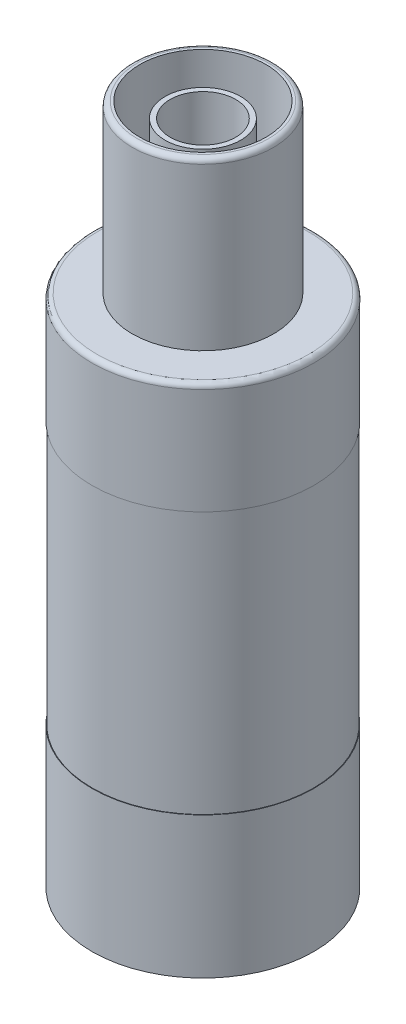
ISO-10303-21;
HEADER;
FILE_DESCRIPTION(('STEP AP214'),'2;1');
FILE_NAME('part.step','',(''),(''),'','','');
FILE_SCHEMA(('AUTOMOTIVE_DESIGN { 1 0 10303 214 1 1 1 1 }'));
ENDSEC;
DATA;
#1=APPLICATION_CONTEXT('core data for automotive mechanical design processes');
#2=APPLICATION_PROTOCOL_DEFINITION('international standard','automotive_design',2000,#1);
#3=PRODUCT_CONTEXT('',#1,'mechanical');
#4=PRODUCT('Part','Part','',(#3));
#5=PRODUCT_RELATED_PRODUCT_CATEGORY('part','',(#4));
#6=PRODUCT_DEFINITION_FORMATION('','',#4);
#7=PRODUCT_DEFINITION_CONTEXT('part definition',#1,'design');
#8=PRODUCT_DEFINITION('design','',#6,#7);
#9=PRODUCT_DEFINITION_SHAPE('','',#8);
#10=(LENGTH_UNIT() NAMED_UNIT(*) SI_UNIT(.MILLI.,.METRE.));
#11=(NAMED_UNIT(*) PLANE_ANGLE_UNIT() SI_UNIT($,.RADIAN.));
#12=(NAMED_UNIT(*) SI_UNIT($,.STERADIAN.) SOLID_ANGLE_UNIT());
#13=UNCERTAINTY_MEASURE_WITH_UNIT(LENGTH_MEASURE(1.E-05),#10,'distance_accuracy_value','');
#14=(GEOMETRIC_REPRESENTATION_CONTEXT(3) GLOBAL_UNCERTAINTY_ASSIGNED_CONTEXT((#13)) GLOBAL_UNIT_ASSIGNED_CONTEXT((#10,
#11,#12)) REPRESENTATION_CONTEXT('',''));
#15=CARTESIAN_POINT('',(0.,0.,0.));
#16=DIRECTION('',(0.,0.,1.));
#17=DIRECTION('',(1.,0.,0.));
#18=AXIS2_PLACEMENT_3D('',#15,#16,#17);
#19=CARTESIAN_POINT('',(0.,14.,0.));
#20=DIRECTION('',(0.,-1.,0.));
#21=DIRECTION('',(0.,0.,-1.));
#22=AXIS2_PLACEMENT_3D('',#19,#20,#21);
#23=CYLINDRICAL_SURFACE('',#22,11.);
#24=CARTESIAN_POINT('',(0.,14.,0.));
#25=DIRECTION('',(0.,1.,0.));
#26=DIRECTION('',(0.,0.,1.));
#27=AXIS2_PLACEMENT_3D('',#24,#25,#26);
#28=CIRCLE('',#27,11.);
#29=CARTESIAN_POINT('',(0.,14.,11.));
#30=VERTEX_POINT('',#29);
#31=EDGE_CURVE('E88',#30,#30,#28,.T.);
#32=ORIENTED_EDGE('',*,*,#31,.F.);
#33=EDGE_LOOP('',(#32));
#34=FACE_BOUND('',#33,.T.);
#35=CARTESIAN_POINT('',(0.,0.,0.));
#36=DIRECTION('',(0.,1.,0.));
#37=DIRECTION('',(0.,0.,1.));
#38=AXIS2_PLACEMENT_3D('',#35,#36,#37);
#39=CIRCLE('',#38,11.);
#40=CARTESIAN_POINT('',(0.,0.,11.));
#41=VERTEX_POINT('',#40);
#42=EDGE_CURVE('E89',#41,#41,#39,.T.);
#43=ORIENTED_EDGE('',*,*,#42,.T.);
#44=EDGE_LOOP('',(#43));
#45=FACE_BOUND('',#44,.T.);
#46=ADVANCED_FACE('F49',(#34,#45),#23,.T.);
#47=CARTESIAN_POINT('',(0.,14.,0.));
#48=DIRECTION('',(0.,1.,0.));
#49=DIRECTION('',(0.,0.,1.));
#50=AXIS2_PLACEMENT_3D('',#47,#48,#49);
#51=PLANE('',#50);
#52=CARTESIAN_POINT('',(0.,14.,0.));
#53=DIRECTION('',(0.,1.,0.));
#54=DIRECTION('',(0.,0.,1.));
#55=AXIS2_PLACEMENT_3D('',#52,#53,#54);
#56=CIRCLE('',#55,10.95);
#57=CARTESIAN_POINT('',(0.,14.,-10.95));
#58=VERTEX_POINT('',#57);
#59=EDGE_CURVE('E95',#58,#58,#56,.T.);
#60=ORIENTED_EDGE('',*,*,#59,.F.);
#61=EDGE_LOOP('',(#60));
#62=FACE_BOUND('',#61,.T.);
#63=ORIENTED_EDGE('',*,*,#31,.T.);
#64=EDGE_LOOP('',(#63));
#65=FACE_BOUND('',#64,.T.);
#66=ADVANCED_FACE('F143',(#62,#65),#51,.T.);
#67=CARTESIAN_POINT('',(0.,0.,0.));
#68=DIRECTION('',(0.,1.,0.));
#69=DIRECTION('',(0.,0.,1.));
#70=AXIS2_PLACEMENT_3D('',#67,#68,#69);
#71=PLANE('',#70);
#72=ORIENTED_EDGE('',*,*,#42,.F.);
#73=EDGE_LOOP('',(#72));
#74=FACE_BOUND('',#73,.T.);
#75=ADVANCED_FACE('F160',(#74),#71,.F.);
#76=CARTESIAN_POINT('',(0.,40.,0.));
#77=DIRECTION('',(0.,-1.,0.));
#78=DIRECTION('',(0.,0.,-1.));
#79=AXIS2_PLACEMENT_3D('',#76,#77,#78);
#80=CYLINDRICAL_SURFACE('',#79,10.95);
#81=CARTESIAN_POINT('',(0.,40.,0.));
#82=DIRECTION('',(0.,1.,0.));
#83=DIRECTION('',(0.,0.,1.));
#84=AXIS2_PLACEMENT_3D('',#81,#82,#83);
#85=CIRCLE('',#84,10.95);
#86=CARTESIAN_POINT('',(0.,40.,-10.95));
#87=VERTEX_POINT('',#86);
#88=EDGE_CURVE('E92',#87,#87,#85,.T.);
#89=CARTESIAN_POINT('',(0.,40.,-10.95));
#90=CARTESIAN_POINT('',(0.,39.7291666666667,-10.95));
#91=CARTESIAN_POINT('',(0.,39.4583333333333,-10.95));
#92=CARTESIAN_POINT('',(0.,38.9166666666667,-10.95));
#93=CARTESIAN_POINT('',(0.,38.6458333333333,-10.95));
#94=CARTESIAN_POINT('',(0.,38.1041666666667,-10.95));
#95=CARTESIAN_POINT('',(0.,37.8333333333333,-10.95));
#96=CARTESIAN_POINT('',(0.,37.2916666666667,-10.95));
#97=CARTESIAN_POINT('',(0.,37.0208333333333,-10.95));
#98=CARTESIAN_POINT('',(0.,36.4791666666667,-10.95));
#99=CARTESIAN_POINT('',(0.,36.2083333333333,-10.95));
#100=CARTESIAN_POINT('',(0.,35.6666666666667,-10.95));
#101=CARTESIAN_POINT('',(0.,35.3958333333333,-10.95));
#102=CARTESIAN_POINT('',(0.,34.8541666666667,-10.95));
#103=CARTESIAN_POINT('',(0.,34.5833333333333,-10.95));
#104=CARTESIAN_POINT('',(0.,34.0416666666667,-10.95));
#105=CARTESIAN_POINT('',(0.,33.7708333333333,-10.95));
#106=CARTESIAN_POINT('',(0.,33.2291666666667,-10.95));
#107=CARTESIAN_POINT('',(0.,32.9583333333333,-10.95));
#108=CARTESIAN_POINT('',(0.,32.4166666666667,-10.95));
#109=CARTESIAN_POINT('',(0.,32.1458333333333,-10.95));
#110=CARTESIAN_POINT('',(0.,31.6041666666667,-10.95));
#111=CARTESIAN_POINT('',(0.,31.3333333333333,-10.95));
#112=CARTESIAN_POINT('',(0.,30.7916666666667,-10.95));
#113=CARTESIAN_POINT('',(0.,30.5208333333333,-10.95));
#114=CARTESIAN_POINT('',(0.,29.9791666666667,-10.95));
#115=CARTESIAN_POINT('',(0.,29.7083333333333,-10.95));
#116=CARTESIAN_POINT('',(0.,29.1666666666667,-10.95));
#117=CARTESIAN_POINT('',(0.,28.8958333333333,-10.95));
#118=CARTESIAN_POINT('',(0.,28.3541666666667,-10.95));
#119=CARTESIAN_POINT('',(0.,28.0833333333333,-10.95));
#120=CARTESIAN_POINT('',(0.,27.5416666666667,-10.95));
#121=CARTESIAN_POINT('',(0.,27.2708333333333,-10.95));
#122=CARTESIAN_POINT('',(0.,26.7291666666667,-10.95));
#123=CARTESIAN_POINT('',(0.,26.4583333333333,-10.95));
#124=CARTESIAN_POINT('',(0.,25.9166666666667,-10.95));
#125=CARTESIAN_POINT('',(0.,25.6458333333333,-10.95));
#126=CARTESIAN_POINT('',(0.,25.1041666666667,-10.95));
#127=CARTESIAN_POINT('',(0.,24.8333333333333,-10.95));
#128=CARTESIAN_POINT('',(0.,24.2916666666667,-10.95));
#129=CARTESIAN_POINT('',(0.,24.0208333333333,-10.95));
#130=CARTESIAN_POINT('',(0.,23.4791666666667,-10.95));
#131=CARTESIAN_POINT('',(0.,23.2083333333333,-10.95));
#132=CARTESIAN_POINT('',(0.,22.6666666666667,-10.95));
#133=CARTESIAN_POINT('',(0.,22.3958333333333,-10.95));
#134=CARTESIAN_POINT('',(0.,21.8541666666667,-10.95));
#135=CARTESIAN_POINT('',(0.,21.5833333333333,-10.95));
#136=CARTESIAN_POINT('',(0.,21.0416666666667,-10.95));
#137=CARTESIAN_POINT('',(0.,20.7708333333333,-10.95));
#138=CARTESIAN_POINT('',(0.,20.2291666666667,-10.95));
#139=CARTESIAN_POINT('',(0.,19.9583333333333,-10.95));
#140=CARTESIAN_POINT('',(0.,19.4166666666667,-10.95));
#141=CARTESIAN_POINT('',(0.,19.1458333333333,-10.95));
#142=CARTESIAN_POINT('',(0.,18.6041666666667,-10.95));
#143=CARTESIAN_POINT('',(0.,18.3333333333333,-10.95));
#144=CARTESIAN_POINT('',(0.,17.7916666666667,-10.95));
#145=CARTESIAN_POINT('',(0.,17.5208333333333,-10.95));
#146=CARTESIAN_POINT('',(0.,16.9791666666667,-10.95));
#147=CARTESIAN_POINT('',(0.,16.7083333333333,-10.95));
#148=CARTESIAN_POINT('',(0.,16.1666666666667,-10.95));
#149=CARTESIAN_POINT('',(0.,15.8958333333333,-10.95));
#150=CARTESIAN_POINT('',(0.,15.3541666666667,-10.95));
#151=CARTESIAN_POINT('',(0.,15.0833333333333,-10.95));
#152=CARTESIAN_POINT('',(0.,14.5416666666667,-10.95));
#153=CARTESIAN_POINT('',(0.,14.2708333333333,-10.95));
#154=CARTESIAN_POINT('',(0.,14.,-10.95));
#155=B_SPLINE_CURVE_WITH_KNOTS('',3,(#89,#90,#91,#92,#93,#94,#95,#96,#97,#98,#99,#100,#101,#102,
#103,#104,#105,#106,#107,#108,#109,#110,#111,#112,#113,#114,#115,#116,#117,#118,#119,#120,#121,
#122,#123,#124,#125,#126,#127,#128,#129,#130,#131,#132,#133,#134,#135,#136,#137,#138,#139,#140,
#141,#142,#143,#144,#145,#146,#147,#148,#149,#150,#151,#152,#153,#154),.UNSPECIFIED.,.F.,.F.,(4,
2,2,2,2,2,2,2,2,2,2,2,2,2,2,2,2,2,2,2,2,2,2,2,2,2,2,2,2,2,2,2,4),(0.,0.812499999999994,
1.62499999999999,2.4375,3.25,4.0625,4.875,5.6875,6.49999999999999,7.31249999999999,
8.12499999999999,8.93749999999999,9.74999999999999,10.5625,11.375,12.1875,13.,13.8125,14.625,
15.4375,16.25,17.0625,17.875,18.6875,19.5,20.3125,21.125,21.9375,22.75,23.5625,24.375,25.1875,
26.),.UNSPECIFIED.);
#156=EDGE_CURVE('BSEAM156',#87,#58,#155,.T.);
#157=ORIENTED_EDGE('',*,*,#88,.F.);
#158=ORIENTED_EDGE('',*,*,#59,.T.);
#159=ORIENTED_EDGE('',*,*,#156,.T.);
#160=ORIENTED_EDGE('',*,*,#156,.F.);
#161=EDGE_LOOP('',(#157,#159,#158,#160));
#162=FACE_BOUND('',#161,.T.);
#163=ADVANCED_FACE('F156',(#162),#80,.T.);
#164=CARTESIAN_POINT('',(0.,40.,0.));
#165=DIRECTION('',(0.,1.,0.));
#166=DIRECTION('',(0.,0.,1.));
#167=AXIS2_PLACEMENT_3D('',#164,#165,#166);
#168=PLANE('',#167);
#169=ORIENTED_EDGE('',*,*,#88,.T.);
#170=EDGE_LOOP('',(#169));
#171=FACE_BOUND('',#170,.T.);
#172=CARTESIAN_POINT('',(0.,40.,0.));
#173=DIRECTION('',(0.,1.,0.));
#174=DIRECTION('',(0.,0.,1.));
#175=AXIS2_PLACEMENT_3D('',#172,#173,#174);
#176=CIRCLE('',#175,11.);
#177=CARTESIAN_POINT('',(0.,40.,11.));
#178=VERTEX_POINT('',#177);
#179=EDGE_CURVE('E103',#178,#178,#176,.T.);
#180=ORIENTED_EDGE('',*,*,#179,.F.);
#181=EDGE_LOOP('',(#180));
#182=FACE_BOUND('',#181,.T.);
#183=ADVANCED_FACE('F154',(#171,#182),#168,.F.);
#184=CARTESIAN_POINT('',(0.,51.,0.));
#185=DIRECTION('',(0.,1.,0.));
#186=DIRECTION('',(0.,0.,1.));
#187=AXIS2_PLACEMENT_3D('',#184,#185,#186);
#188=PLANE('',#187);
#189=CARTESIAN_POINT('',(0.,51.,0.));
#190=DIRECTION('',(0.,1.,0.));
#191=DIRECTION('',(0.,0.,1.));
#192=AXIS2_PLACEMENT_3D('',#189,#190,#191);
#193=CIRCLE('',#192,10.5);
#194=CARTESIAN_POINT('',(0.,51.,10.5));
#195=VERTEX_POINT('',#194);
#196=EDGE_CURVE('E76',#195,#195,#193,.T.);
#197=ORIENTED_EDGE('',*,*,#196,.T.);
#198=EDGE_LOOP('',(#197));
#199=FACE_BOUND('',#198,.T.);
#200=CARTESIAN_POINT('',(0.,51.,0.));
#201=DIRECTION('',(0.,1.,0.));
#202=DIRECTION('',(0.,0.,1.));
#203=AXIS2_PLACEMENT_3D('',#200,#201,#202);
#204=CIRCLE('',#203,7.);
#205=CARTESIAN_POINT('',(0.,51.,7.));
#206=VERTEX_POINT('',#205);
#207=EDGE_CURVE('E107',#206,#206,#204,.T.);
#208=ORIENTED_EDGE('',*,*,#207,.F.);
#209=EDGE_LOOP('',(#208));
#210=FACE_BOUND('',#209,.T.);
#211=ADVANCED_FACE('F200',(#199,#210),#188,.T.);
#212=CARTESIAN_POINT('',(0.,51.,0.));
#213=DIRECTION('',(0.,-1.,0.));
#214=DIRECTION('',(0.,0.,-1.));
#215=AXIS2_PLACEMENT_3D('',#212,#213,#214);
#216=CYLINDRICAL_SURFACE('',#215,11.);
#217=CARTESIAN_POINT('',(0.,50.5,0.));
#218=DIRECTION('',(0.,1.,0.));
#219=DIRECTION('',(0.,0.,1.));
#220=AXIS2_PLACEMENT_3D('',#217,#218,#219);
#221=CIRCLE('',#220,11.);
#222=CARTESIAN_POINT('',(0.,50.5,11.));
#223=VERTEX_POINT('',#222);
#224=EDGE_CURVE('E73',#223,#223,#221,.F.);
#225=ORIENTED_EDGE('',*,*,#224,.T.);
#226=EDGE_LOOP('',(#225));
#227=FACE_BOUND('',#226,.T.);
#228=ORIENTED_EDGE('',*,*,#179,.T.);
#229=EDGE_LOOP('',(#228));
#230=FACE_BOUND('',#229,.T.);
#231=ADVANCED_FACE('F192',(#227,#230),#216,.T.);
#232=CARTESIAN_POINT('',(0.,67.5,0.));
#233=DIRECTION('',(0.,-1.,0.));
#234=DIRECTION('',(0.,0.,-1.));
#235=AXIS2_PLACEMENT_3D('',#232,#233,#234);
#236=CYLINDRICAL_SURFACE('',#235,6.25);
#237=CARTESIAN_POINT('',(0.,67.5,0.));
#238=DIRECTION('',(0.,1.,0.));
#239=DIRECTION('',(0.,0.,1.));
#240=AXIS2_PLACEMENT_3D('',#237,#238,#239);
#241=CIRCLE('',#240,6.25);
#242=CARTESIAN_POINT('',(0.,67.5,6.25));
#243=VERTEX_POINT('',#242);
#244=EDGE_CURVE('E106',#243,#243,#241,.T.);
#245=ORIENTED_EDGE('',*,*,#244,.T.);
#246=EDGE_LOOP('',(#245));
#247=FACE_BOUND('',#246,.T.);
#248=CARTESIAN_POINT('',(0.,51.,0.));
#249=DIRECTION('',(0.,1.,0.));
#250=DIRECTION('',(0.,0.,1.));
#251=AXIS2_PLACEMENT_3D('',#248,#249,#250);
#252=CIRCLE('',#251,6.25);
#253=CARTESIAN_POINT('',(0.,51.,6.25));
#254=VERTEX_POINT('',#253);
#255=EDGE_CURVE('E82',#254,#254,#252,.F.);
#256=ORIENTED_EDGE('',*,*,#255,.T.);
#257=EDGE_LOOP('',(#256));
#258=FACE_BOUND('',#257,.T.);
#259=ADVANCED_FACE('F189',(#247,#258),#236,.F.);
#260=CARTESIAN_POINT('',(0.,67.5,0.));
#261=DIRECTION('',(0.,-1.,0.));
#262=DIRECTION('',(0.,0.,-1.));
#263=AXIS2_PLACEMENT_3D('',#260,#261,#262);
#264=CYLINDRICAL_SURFACE('',#263,7.);
#265=CARTESIAN_POINT('',(0.,67.,0.));
#266=DIRECTION('',(0.,1.,0.));
#267=DIRECTION('',(0.,0.,1.));
#268=AXIS2_PLACEMENT_3D('',#265,#266,#267);
#269=CIRCLE('',#268,7.);
#270=CARTESIAN_POINT('',(0.,67.,7.));
#271=VERTEX_POINT('',#270);
#272=EDGE_CURVE('E65',#271,#271,#269,.F.);
#273=ORIENTED_EDGE('',*,*,#272,.T.);
#274=EDGE_LOOP('',(#273));
#275=FACE_BOUND('',#274,.T.);
#276=ORIENTED_EDGE('',*,*,#207,.T.);
#277=EDGE_LOOP('',(#276));
#278=FACE_BOUND('',#277,.T.);
#279=ADVANCED_FACE('F185',(#275,#278),#264,.T.);
#280=CARTESIAN_POINT('',(0.,67.5,0.));
#281=DIRECTION('',(0.,1.,0.));
#282=DIRECTION('',(0.,0.,1.));
#283=AXIS2_PLACEMENT_3D('',#280,#281,#282);
#284=PLANE('',#283);
#285=CARTESIAN_POINT('',(0.,67.5,0.));
#286=DIRECTION('',(0.,1.,0.));
#287=DIRECTION('',(0.,0.,1.));
#288=AXIS2_PLACEMENT_3D('',#285,#286,#287);
#289=CIRCLE('',#288,6.5);
#290=CARTESIAN_POINT('',(0.,67.5,6.5));
#291=VERTEX_POINT('',#290);
#292=EDGE_CURVE('E70',#291,#291,#289,.T.);
#293=ORIENTED_EDGE('',*,*,#292,.T.);
#294=EDGE_LOOP('',(#293));
#295=FACE_BOUND('',#294,.T.);
#296=ORIENTED_EDGE('',*,*,#244,.F.);
#297=EDGE_LOOP('',(#296));
#298=FACE_BOUND('',#297,.T.);
#299=ADVANCED_FACE('F181',(#295,#298),#284,.T.);
#300=CARTESIAN_POINT('',(0.,51.,0.));
#301=DIRECTION('',(0.,1.,0.));
#302=DIRECTION('',(0.,0.,1.));
#303=AXIS2_PLACEMENT_3D('',#300,#301,#302);
#304=CIRCLE('',#303,3.75);
#305=CARTESIAN_POINT('',(0.,51.,3.75));
#306=VERTEX_POINT('',#305);
#307=EDGE_CURVE('E113',#306,#306,#304,.T.);
#308=ORIENTED_EDGE('',*,*,#307,.F.);
#309=EDGE_LOOP('',(#308));
#310=FACE_BOUND('',#309,.T.);
#311=ORIENTED_EDGE('',*,*,#255,.F.);
#312=EDGE_LOOP('',(#311));
#313=FACE_BOUND('',#312,.T.);
#314=ADVANCED_FACE('F184',(#310,#313),#188,.T.);
#315=CARTESIAN_POINT('',(0.,66.,0.));
#316=DIRECTION('',(0.,-1.,0.));
#317=DIRECTION('',(0.,0.,-1.));
#318=AXIS2_PLACEMENT_3D('',#315,#316,#317);
#319=CYLINDRICAL_SURFACE('',#318,3.25);
#320=CARTESIAN_POINT('',(0.,66.,0.));
#321=DIRECTION('',(0.,1.,0.));
#322=DIRECTION('',(0.,0.,1.));
#323=AXIS2_PLACEMENT_3D('',#320,#321,#322);
#324=CIRCLE('',#323,3.25);
#325=CARTESIAN_POINT('',(0.,66.,3.25));
#326=VERTEX_POINT('',#325);
#327=EDGE_CURVE('E116',#326,#326,#324,.T.);
#328=ORIENTED_EDGE('',*,*,#327,.T.);
#329=EDGE_LOOP('',(#328));
#330=FACE_BOUND('',#329,.T.);
#331=CARTESIAN_POINT('',(0.,51.,0.));
#332=DIRECTION('',(0.,1.,0.));
#333=DIRECTION('',(0.,0.,1.));
#334=AXIS2_PLACEMENT_3D('',#331,#332,#333);
#335=CIRCLE('',#334,3.25);
#336=CARTESIAN_POINT('',(0.,51.,3.25));
#337=VERTEX_POINT('',#336);
#338=EDGE_CURVE('E79',#337,#337,#335,.F.);
#339=ORIENTED_EDGE('',*,*,#338,.T.);
#340=EDGE_LOOP('',(#339));
#341=FACE_BOUND('',#340,.T.);
#342=ADVANCED_FACE('F197',(#330,#341),#319,.F.);
#343=CARTESIAN_POINT('',(0.,66.,0.));
#344=DIRECTION('',(0.,-1.,0.));
#345=DIRECTION('',(0.,0.,-1.));
#346=AXIS2_PLACEMENT_3D('',#343,#344,#345);
#347=CYLINDRICAL_SURFACE('',#346,3.75);
#348=CARTESIAN_POINT('',(0.,66.,0.));
#349=DIRECTION('',(0.,1.,0.));
#350=DIRECTION('',(0.,0.,1.));
#351=AXIS2_PLACEMENT_3D('',#348,#349,#350);
#352=CIRCLE('',#351,3.75);
#353=CARTESIAN_POINT('',(0.,66.,3.75));
#354=VERTEX_POINT('',#353);
#355=EDGE_CURVE('E110',#354,#354,#352,.T.);
#356=ORIENTED_EDGE('',*,*,#355,.F.);
#357=EDGE_LOOP('',(#356));
#358=FACE_BOUND('',#357,.T.);
#359=ORIENTED_EDGE('',*,*,#307,.T.);
#360=EDGE_LOOP('',(#359));
#361=FACE_BOUND('',#360,.T.);
#362=ADVANCED_FACE('F204',(#358,#361),#347,.T.);
#363=CARTESIAN_POINT('',(0.,66.,0.));
#364=DIRECTION('',(0.,1.,0.));
#365=DIRECTION('',(0.,0.,1.));
#366=AXIS2_PLACEMENT_3D('',#363,#364,#365);
#367=PLANE('',#366);
#368=ORIENTED_EDGE('',*,*,#327,.F.);
#369=EDGE_LOOP('',(#368));
#370=FACE_BOUND('',#369,.T.);
#371=ORIENTED_EDGE('',*,*,#355,.T.);
#372=EDGE_LOOP('',(#371));
#373=FACE_BOUND('',#372,.T.);
#374=ADVANCED_FACE('F211',(#370,#373),#367,.T.);
#375=ORIENTED_EDGE('',*,*,#338,.F.);
#376=EDGE_LOOP('',(#375));
#377=FACE_BOUND('',#376,.T.);
#378=ADVANCED_FACE('F171',(#377),#188,.T.);
#379=CARTESIAN_POINT('',(0.,50.5,0.));
#380=DIRECTION('',(0.,1.,0.));
#381=DIRECTION('',(0.,0.,1.));
#382=AXIS2_PLACEMENT_3D('',#379,#380,#381);
#383=TOROIDAL_SURFACE('',#382,10.5,0.5);
#384=ORIENTED_EDGE('',*,*,#224,.F.);
#385=EDGE_LOOP('',(#384));
#386=FACE_BOUND('',#385,.T.);
#387=ORIENTED_EDGE('',*,*,#196,.F.);
#388=EDGE_LOOP('',(#387));
#389=FACE_BOUND('',#388,.T.);
#390=ADVANCED_FACE('F168',(#386,#389),#383,.T.);
#391=CARTESIAN_POINT('',(0.,67.,0.));
#392=DIRECTION('',(0.,1.,0.));
#393=DIRECTION('',(0.,0.,1.));
#394=AXIS2_PLACEMENT_3D('',#391,#392,#393);
#395=TOROIDAL_SURFACE('',#394,6.5,0.5);
#396=ORIENTED_EDGE('',*,*,#272,.F.);
#397=EDGE_LOOP('',(#396));
#398=FACE_BOUND('',#397,.T.);
#399=ORIENTED_EDGE('',*,*,#292,.F.);
#400=EDGE_LOOP('',(#399));
#401=FACE_BOUND('',#400,.T.);
#402=ADVANCED_FACE('F170',(#398,#401),#395,.T.);
#403=CLOSED_SHELL('',(#46,#66,#75,#163,#183,#211,#231,#259,#279,#299,#314,#342,#362,#374,#378,
#390,#402));
#404=CARTESIAN_POINT('',(0.,14.,0.));
#405=DIRECTION('',(0.,1.,0.));
#406=DIRECTION('',(0.,0.,1.));
#407=AXIS2_PLACEMENT_3D('',#404,#405,#406);
#408=CIRCLE('',#407,9.);
#409=CARTESIAN_POINT('',(0.,14.,9.));
#410=VERTEX_POINT('',#409);
#411=EDGE_CURVE('E122',#410,#410,#408,.T.);
#412=ORIENTED_EDGE('',*,*,#411,.F.);
#413=EDGE_LOOP('',(#412));
#414=FACE_BOUND('',#413,.T.);
#415=CARTESIAN_POINT('',(0.,14.,0.));
#416=DIRECTION('',(0.,1.,0.));
#417=DIRECTION('',(0.,0.,1.));
#418=AXIS2_PLACEMENT_3D('',#415,#416,#417);
#419=CIRCLE('',#418,10.9);
#420=CARTESIAN_POINT('',(0.,14.,-10.9));
#421=VERTEX_POINT('',#420);
#422=EDGE_CURVE('E85',#421,#421,#419,.F.);
#423=ORIENTED_EDGE('',*,*,#422,.F.);
#424=EDGE_LOOP('',(#423));
#425=FACE_BOUND('',#424,.T.);
#426=ADVANCED_FACE('F138',(#414,#425),#51,.T.);
#427=CARTESIAN_POINT('',(0.,40.,0.));
#428=DIRECTION('',(0.,-1.,0.));
#429=DIRECTION('',(0.,0.,-1.));
#430=AXIS2_PLACEMENT_3D('',#427,#428,#429);
#431=CYLINDRICAL_SURFACE('',#430,10.9);
#432=CARTESIAN_POINT('',(0.,40.,0.));
#433=DIRECTION('',(0.,1.,0.));
#434=DIRECTION('',(0.,0.,1.));
#435=AXIS2_PLACEMENT_3D('',#432,#433,#434);
#436=CIRCLE('',#435,10.9);
#437=CARTESIAN_POINT('',(0.,40.,-10.9));
#438=VERTEX_POINT('',#437);
#439=EDGE_CURVE('E98',#438,#438,#436,.T.);
#440=CARTESIAN_POINT('',(0.,40.,-10.9));
#441=CARTESIAN_POINT('',(0.,39.7291666666667,-10.9));
#442=CARTESIAN_POINT('',(0.,39.4583333333333,-10.9));
#443=CARTESIAN_POINT('',(0.,38.9166666666667,-10.9));
#444=CARTESIAN_POINT('',(0.,38.6458333333333,-10.9));
#445=CARTESIAN_POINT('',(0.,38.1041666666667,-10.9));
#446=CARTESIAN_POINT('',(0.,37.8333333333333,-10.9));
#447=CARTESIAN_POINT('',(0.,37.2916666666667,-10.9));
#448=CARTESIAN_POINT('',(0.,37.0208333333333,-10.9));
#449=CARTESIAN_POINT('',(0.,36.4791666666667,-10.9));
#450=CARTESIAN_POINT('',(0.,36.2083333333333,-10.9));
#451=CARTESIAN_POINT('',(0.,35.6666666666667,-10.9));
#452=CARTESIAN_POINT('',(0.,35.3958333333333,-10.9));
#453=CARTESIAN_POINT('',(0.,34.8541666666667,-10.9));
#454=CARTESIAN_POINT('',(0.,34.5833333333333,-10.9));
#455=CARTESIAN_POINT('',(0.,34.0416666666667,-10.9));
#456=CARTESIAN_POINT('',(0.,33.7708333333333,-10.9));
#457=CARTESIAN_POINT('',(0.,33.2291666666667,-10.9));
#458=CARTESIAN_POINT('',(0.,32.9583333333333,-10.9));
#459=CARTESIAN_POINT('',(0.,32.4166666666667,-10.9));
#460=CARTESIAN_POINT('',(0.,32.1458333333333,-10.9));
#461=CARTESIAN_POINT('',(0.,31.6041666666667,-10.9));
#462=CARTESIAN_POINT('',(0.,31.3333333333333,-10.9));
#463=CARTESIAN_POINT('',(0.,30.7916666666667,-10.9));
#464=CARTESIAN_POINT('',(0.,30.5208333333333,-10.9));
#465=CARTESIAN_POINT('',(0.,29.9791666666667,-10.9));
#466=CARTESIAN_POINT('',(0.,29.7083333333333,-10.9));
#467=CARTESIAN_POINT('',(0.,29.1666666666667,-10.9));
#468=CARTESIAN_POINT('',(0.,28.8958333333333,-10.9));
#469=CARTESIAN_POINT('',(0.,28.3541666666667,-10.9));
#470=CARTESIAN_POINT('',(0.,28.0833333333333,-10.9));
#471=CARTESIAN_POINT('',(0.,27.5416666666667,-10.9));
#472=CARTESIAN_POINT('',(0.,27.2708333333333,-10.9));
#473=CARTESIAN_POINT('',(0.,26.7291666666667,-10.9));
#474=CARTESIAN_POINT('',(0.,26.4583333333333,-10.9));
#475=CARTESIAN_POINT('',(0.,25.9166666666667,-10.9));
#476=CARTESIAN_POINT('',(0.,25.6458333333333,-10.9));
#477=CARTESIAN_POINT('',(0.,25.1041666666667,-10.9));
#478=CARTESIAN_POINT('',(0.,24.8333333333333,-10.9));
#479=CARTESIAN_POINT('',(0.,24.2916666666667,-10.9));
#480=CARTESIAN_POINT('',(0.,24.0208333333333,-10.9));
#481=CARTESIAN_POINT('',(0.,23.4791666666667,-10.9));
#482=CARTESIAN_POINT('',(0.,23.2083333333333,-10.9));
#483=CARTESIAN_POINT('',(0.,22.6666666666667,-10.9));
#484=CARTESIAN_POINT('',(0.,22.3958333333333,-10.9));
#485=CARTESIAN_POINT('',(0.,21.8541666666667,-10.9));
#486=CARTESIAN_POINT('',(0.,21.5833333333333,-10.9));
#487=CARTESIAN_POINT('',(0.,21.0416666666667,-10.9));
#488=CARTESIAN_POINT('',(0.,20.7708333333333,-10.9));
#489=CARTESIAN_POINT('',(0.,20.2291666666667,-10.9));
#490=CARTESIAN_POINT('',(0.,19.9583333333333,-10.9));
#491=CARTESIAN_POINT('',(0.,19.4166666666667,-10.9));
#492=CARTESIAN_POINT('',(0.,19.1458333333333,-10.9));
#493=CARTESIAN_POINT('',(0.,18.6041666666667,-10.9));
#494=CARTESIAN_POINT('',(0.,18.3333333333333,-10.9));
#495=CARTESIAN_POINT('',(0.,17.7916666666667,-10.9));
#496=CARTESIAN_POINT('',(0.,17.5208333333333,-10.9));
#497=CARTESIAN_POINT('',(0.,16.9791666666667,-10.9));
#498=CARTESIAN_POINT('',(0.,16.7083333333333,-10.9));
#499=CARTESIAN_POINT('',(0.,16.1666666666667,-10.9));
#500=CARTESIAN_POINT('',(0.,15.8958333333333,-10.9));
#501=CARTESIAN_POINT('',(0.,15.3541666666667,-10.9));
#502=CARTESIAN_POINT('',(0.,15.0833333333333,-10.9));
#503=CARTESIAN_POINT('',(0.,14.5416666666667,-10.9));
#504=CARTESIAN_POINT('',(0.,14.2708333333333,-10.9));
#505=CARTESIAN_POINT('',(0.,14.,-10.9));
#506=B_SPLINE_CURVE_WITH_KNOTS('',3,(#440,#441,#442,#443,#444,#445,#446,#447,#448,#449,#450,
#451,#452,#453,#454,#455,#456,#457,#458,#459,#460,#461,#462,#463,#464,#465,#466,#467,#468,#469,
#470,#471,#472,#473,#474,#475,#476,#477,#478,#479,#480,#481,#482,#483,#484,#485,#486,#487,#488,
#489,#490,#491,#492,#493,#494,#495,#496,#497,#498,#499,#500,#501,#502,#503,#504,#505),
.UNSPECIFIED.,.F.,.F.,(4,2,2,2,2,2,2,2,2,2,2,2,2,2,2,2,2,2,2,2,2,2,2,2,2,2,2,2,2,2,2,2,4),(0.,
0.812500000000001,1.625,2.4375,3.25,4.0625,4.875,5.68750000000001,6.50000000000001,
7.31250000000001,8.125,8.93750000000001,9.75,10.5625,11.375,12.1875,13.,13.8125,14.625,15.4375,
16.25,17.0625,17.875,18.6875,19.5,20.3125,21.125,21.9375,22.75,23.5625,24.375,25.1875,26.),.UNSPECIFIED.);
#507=EDGE_CURVE('BSEAM141',#438,#421,#506,.T.);
#508=ORIENTED_EDGE('',*,*,#439,.T.);
#509=ORIENTED_EDGE('',*,*,#422,.T.);
#510=ORIENTED_EDGE('',*,*,#507,.T.);
#511=ORIENTED_EDGE('',*,*,#507,.F.);
#512=EDGE_LOOP('',(#508,#510,#509,#511));
#513=FACE_BOUND('',#512,.T.);
#514=ADVANCED_FACE('F141',(#513),#431,.F.);
#515=CARTESIAN_POINT('',(0.,40.,0.));
#516=DIRECTION('',(0.,1.,0.));
#517=DIRECTION('',(0.,0.,1.));
#518=AXIS2_PLACEMENT_3D('',#515,#516,#517);
#519=CIRCLE('',#518,4.76282289086122);
#520=CARTESIAN_POINT('',(0.,40.,4.76282289086122));
#521=VERTEX_POINT('',#520);
#522=EDGE_CURVE('E61',#521,#521,#519,.F.);
#523=ORIENTED_EDGE('',*,*,#522,.F.);
#524=EDGE_LOOP('',(#523));
#525=FACE_BOUND('',#524,.T.);
#526=ORIENTED_EDGE('',*,*,#439,.F.);
#527=EDGE_LOOP('',(#526));
#528=FACE_BOUND('',#527,.T.);
#529=ADVANCED_FACE('F133',(#525,#528),#168,.F.);
#530=CARTESIAN_POINT('',(0.,29.,0.));
#531=DIRECTION('',(0.,-1.,0.));
#532=DIRECTION('',(0.,0.,-1.));
#533=AXIS2_PLACEMENT_3D('',#530,#531,#532);
#534=CYLINDRICAL_SURFACE('',#533,9.);
#535=CARTESIAN_POINT('',(0.,29.,0.));
#536=DIRECTION('',(0.,1.,0.));
#537=DIRECTION('',(0.,0.,1.));
#538=AXIS2_PLACEMENT_3D('',#535,#536,#537);
#539=CIRCLE('',#538,9.);
#540=CARTESIAN_POINT('',(0.,29.,9.));
#541=VERTEX_POINT('',#540);
#542=EDGE_CURVE('E117',#541,#541,#539,.T.);
#543=ORIENTED_EDGE('',*,*,#542,.F.);
#544=EDGE_LOOP('',(#543));
#545=FACE_BOUND('',#544,.T.);
#546=ORIENTED_EDGE('',*,*,#411,.T.);
#547=EDGE_LOOP('',(#546));
#548=FACE_BOUND('',#547,.T.);
#549=ADVANCED_FACE('F130',(#545,#548),#534,.T.);
#550=CARTESIAN_POINT('',(0.,29.,0.));
#551=DIRECTION('',(0.,1.,0.));
#552=DIRECTION('',(0.,0.,1.));
#553=AXIS2_PLACEMENT_3D('',#550,#551,#552);
#554=PLANE('',#553);
#555=CARTESIAN_POINT('',(0.,29.,0.));
#556=DIRECTION('',(0.,1.,0.));
#557=DIRECTION('',(0.,0.,1.));
#558=AXIS2_PLACEMENT_3D('',#555,#556,#557);
#559=CIRCLE('',#558,8.76282289086119);
#560=CARTESIAN_POINT('',(0.,29.,-8.76282289086119));
#561=VERTEX_POINT('',#560);
#562=EDGE_CURVE('E12',#561,#561,#559,.F.);
#563=ORIENTED_EDGE('',*,*,#562,.T.);
#564=EDGE_LOOP('',(#563));
#565=FACE_BOUND('',#564,.T.);
#566=ORIENTED_EDGE('',*,*,#542,.T.);
#567=EDGE_LOOP('',(#566));
#568=FACE_BOUND('',#567,.T.);
#569=ADVANCED_FACE('F128',(#565,#568),#554,.T.);
#570=CARTESIAN_POINT('',(0.,44.,0.));
#571=DIRECTION('',(0.,-1.,0.));
#572=DIRECTION('',(0.,0.,-1.));
#573=AXIS2_PLACEMENT_3D('',#570,#571,#572);
#574=CYLINDRICAL_SURFACE('',#573,4.76282289086122);
#575=CARTESIAN_POINT('',(0.,31.8008301528388,0.));
#576=DIRECTION('',(0.,1.,0.));
#577=DIRECTION('',(0.,0.,1.));
#578=AXIS2_PLACEMENT_3D('',#575,#576,#577);
#579=CIRCLE('',#578,4.76282289086122);
#580=CARTESIAN_POINT('',(0.,31.8008301528388,-4.76282289086123));
#581=VERTEX_POINT('',#580);
#582=EDGE_CURVE('E57',#581,#581,#579,.T.);
#583=ORIENTED_EDGE('',*,*,#582,.T.);
#584=EDGE_LOOP('',(#583));
#585=FACE_BOUND('',#584,.T.);
#586=ORIENTED_EDGE('',*,*,#522,.T.);
#587=EDGE_LOOP('',(#586));
#588=FACE_BOUND('',#587,.T.);
#589=ADVANCED_FACE('F286',(#585,#588),#574,.T.);
#590=CARTESIAN_POINT('',(0.,31.8008301528388,0.));
#591=DIRECTION('',(0.,-1.,0.));
#592=DIRECTION('',(0.,0.,-1.));
#593=AXIS2_PLACEMENT_3D('',#590,#591,#592);
#594=CONICAL_SURFACE('',#593,4.76282289086122,0.959931088596875);
#595=CARTESIAN_POINT('',(0.,29.,-8.76282289086119));
#596=CARTESIAN_POINT('',(0.,29.0291753140921,-8.72115622419452));
#597=CARTESIAN_POINT('',(0.,29.0583506281841,-8.67948955752786));
#598=CARTESIAN_POINT('',(0.,29.1167012563683,-8.59615622419453));
#599=CARTESIAN_POINT('',(0.,29.1458765704604,-8.55448955752786));
#600=CARTESIAN_POINT('',(0.,29.2042271986445,-8.47115622419453));
#601=CARTESIAN_POINT('',(0.,29.2334025127366,-8.42948955752786));
#602=CARTESIAN_POINT('',(0.,29.2917531409207,-8.34615622419453));
#603=CARTESIAN_POINT('',(0.,29.3209284550128,-8.30448955752786));
#604=CARTESIAN_POINT('',(0.,29.3792790831969,-8.22115622419453));
#605=CARTESIAN_POINT('',(0.,29.408454397289,-8.17948955752786));
#606=CARTESIAN_POINT('',(0.,29.4668050254731,-8.09615622419453));
#607=CARTESIAN_POINT('',(0.,29.4959803395652,-8.05448955752786));
#608=CARTESIAN_POINT('',(0.,29.5543309677494,-7.97115622419453));
#609=CARTESIAN_POINT('',(0.,29.5835062818414,-7.92948955752787));
#610=CARTESIAN_POINT('',(0.,29.6418569100256,-7.84615622419453));
#611=CARTESIAN_POINT('',(0.,29.6710322241176,-7.80448955752787));
#612=CARTESIAN_POINT('',(0.,29.7293828523018,-7.72115622419453));
#613=CARTESIAN_POINT('',(0.,29.7585581663939,-7.67948955752787));
#614=CARTESIAN_POINT('',(0.,29.816908794578,-7.59615622419454));
#615=CARTESIAN_POINT('',(0.,29.8460841086701,-7.55448955752787));
#616=CARTESIAN_POINT('',(0.,29.9044347368542,-7.47115622419454));
#617=CARTESIAN_POINT('',(0.,29.9336100509463,-7.42948955752787));
#618=CARTESIAN_POINT('',(0.,29.9919606791304,-7.34615622419454));
#619=CARTESIAN_POINT('',(0.,30.0211359932225,-7.30448955752787));
#620=CARTESIAN_POINT('',(0.,30.0794866214066,-7.22115622419454));
#621=CARTESIAN_POINT('',(0.,30.1086619354987,-7.17948955752787));
#622=CARTESIAN_POINT('',(0.,30.1670125636828,-7.09615622419454));
#623=CARTESIAN_POINT('',(0.,30.1961878777749,-7.05448955752787));
#624=CARTESIAN_POINT('',(0.,30.2545385059591,-6.97115622419454));
#625=CARTESIAN_POINT('',(0.,30.2837138200511,-6.92948955752787));
#626=CARTESIAN_POINT('',(0.,30.3420644482353,-6.84615622419454));
#627=CARTESIAN_POINT('',(0.,30.3712397623273,-6.80448955752788));
#628=CARTESIAN_POINT('',(0.,30.4295903905115,-6.72115622419454));
#629=CARTESIAN_POINT('',(0.,30.4587657046036,-6.67948955752788));
#630=CARTESIAN_POINT('',(0.,30.5171163327877,-6.59615622419454));
#631=CARTESIAN_POINT('',(0.,30.5462916468798,-6.55448955752788));
#632=CARTESIAN_POINT('',(0.,30.6046422750639,-6.47115622419455));
#633=CARTESIAN_POINT('',(0.,30.633817589156,-6.42948955752788));
#634=CARTESIAN_POINT('',(0.,30.6921682173401,-6.34615622419455));
#635=CARTESIAN_POINT('',(0.,30.7213435314322,-6.30448955752788));
#636=CARTESIAN_POINT('',(0.,30.7796941596163,-6.22115622419455));
#637=CARTESIAN_POINT('',(0.,30.8088694737084,-6.17948955752788));
#638=CARTESIAN_POINT('',(0.,30.8672201018926,-6.09615622419455));
#639=CARTESIAN_POINT('',(0.,30.8963954159846,-6.05448955752788));
#640=CARTESIAN_POINT('',(0.,30.9547460441688,-5.97115622419455));
#641=CARTESIAN_POINT('',(0.,30.9839213582608,-5.92948955752788));
#642=CARTESIAN_POINT('',(0.,31.042271986445,-5.84615622419455));
#643=CARTESIAN_POINT('',(0.,31.0714473005371,-5.80448955752789));
#644=CARTESIAN_POINT('',(0.,31.1297979287212,-5.72115622419455));
#645=CARTESIAN_POINT('',(0.,31.1589732428133,-5.67948955752789));
#646=CARTESIAN_POINT('',(0.,31.2173238709974,-5.59615622419455));
#647=CARTESIAN_POINT('',(0.,31.2464991850895,-5.55448955752789));
#648=CARTESIAN_POINT('',(0.,31.3048498132736,-5.47115622419456));
#649=CARTESIAN_POINT('',(0.,31.3340251273657,-5.42948955752789));
#650=CARTESIAN_POINT('',(0.,31.3923757555498,-5.34615622419456));
#651=CARTESIAN_POINT('',(0.,31.4215510696419,-5.30448955752789));
#652=CARTESIAN_POINT('',(0.,31.4799016978261,-5.22115622419456));
#653=CARTESIAN_POINT('',(0.,31.5090770119181,-5.17948955752789));
#654=CARTESIAN_POINT('',(0.,31.5674276401023,-5.09615622419456));
#655=CARTESIAN_POINT('',(0.,31.5966029541943,-5.05448955752789));
#656=CARTESIAN_POINT('',(0.,31.6549535823785,-4.97115622419456));
#657=CARTESIAN_POINT('',(0.,31.6841288964706,-4.92948955752789));
#658=CARTESIAN_POINT('',(0.,31.7424795246547,-4.84615622419456));
#659=CARTESIAN_POINT('',(0.,31.7716548387468,-4.80448955752789));
#660=CARTESIAN_POINT('',(0.,31.8008301528388,-4.76282289086123));
#661=B_SPLINE_CURVE_WITH_KNOTS('',3,(#595,#596,#597,#598,#599,#600,#601,#602,#603,#604,#605,
#606,#607,#608,#609,#610,#611,#612,#613,#614,#615,#616,#617,#618,#619,#620,#621,#622,#623,#624,
#625,#626,#627,#628,#629,#630,#631,#632,#633,#634,#635,#636,#637,#638,#639,#640,#641,#642,#643,
#644,#645,#646,#647,#648,#649,#650,#651,#652,#653,#654,#655,#656,#657,#658,#659,#660),
.UNSPECIFIED.,.F.,.F.,(4,2,2,2,2,2,2,2,2,2,2,2,2,2,2,2,2,2,2,2,2,2,2,2,2,2,2,2,2,2,2,2,4),(0.,
0.152596823595182,0.305193647190363,0.457790470785545,0.610387294380725,0.762984117975906,
0.915580941571086,1.06817776516627,1.22077458876145,1.37337141235663,1.52596823595181,
1.67856505954699,1.83116188314217,1.98375870673736,2.13635553033254,2.28895235392772,
2.4415491775229,2.59414600111808,2.74674282471326,2.89933964830844,3.05193647190363,
3.20453329549881,3.35713011909399,3.50972694268917,3.66232376628435,3.81492058987953,
3.96751741347471,4.12011423706989,4.27271106066507,4.42530788426026,4.57790470785544,
4.73050153145062,4.8830983550458),.UNSPECIFIED.);
#662=EDGE_CURVE('BSEAM51',#561,#581,#661,.T.);
#663=ORIENTED_EDGE('',*,*,#562,.F.);
#664=ORIENTED_EDGE('',*,*,#582,.F.);
#665=ORIENTED_EDGE('',*,*,#662,.T.);
#666=ORIENTED_EDGE('',*,*,#662,.F.);
#667=EDGE_LOOP('',(#663,#665,#664,#666));
#668=FACE_BOUND('',#667,.T.);
#669=ADVANCED_FACE('F51',(#668),#594,.T.);
#670=CLOSED_SHELL('',(#426,#514,#529,#549,#569,#589,#669));
#671=ORIENTED_CLOSED_SHELL('',*,#670,.T.);
#672=BREP_WITH_VOIDS('B2',#403,(#671));
#673=ADVANCED_BREP_SHAPE_REPRESENTATION('',(#18,#672),#14);
#674=SHAPE_DEFINITION_REPRESENTATION(#9,#673);
ENDSEC;
END-ISO-10303-21;
